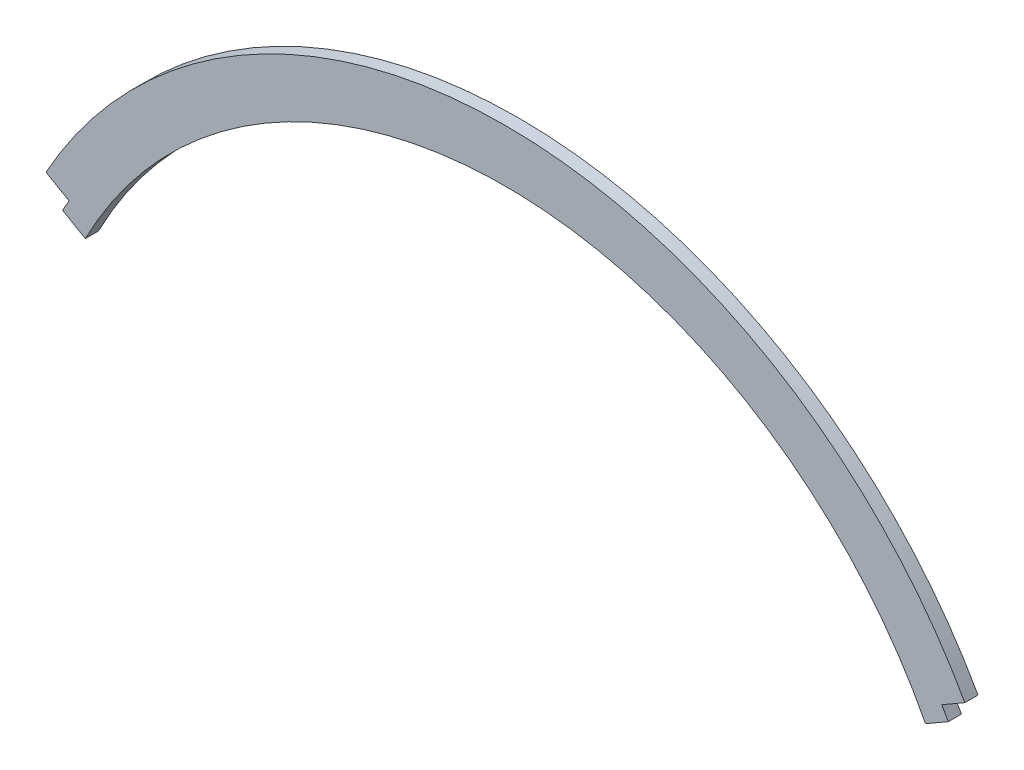
ISO-10303-21;
HEADER;
FILE_DESCRIPTION(('STEP AP214'),'2;1');
FILE_NAME('part.step','',(''),(''),'','','');
FILE_SCHEMA(('AUTOMOTIVE_DESIGN { 1 0 10303 214 1 1 1 1 }'));
ENDSEC;
DATA;
#1=APPLICATION_CONTEXT('core data for automotive mechanical design processes');
#2=APPLICATION_PROTOCOL_DEFINITION('international standard','automotive_design',2000,#1);
#3=PRODUCT_CONTEXT('',#1,'mechanical');
#4=PRODUCT('Part','Part','',(#3));
#5=PRODUCT_RELATED_PRODUCT_CATEGORY('part','',(#4));
#6=PRODUCT_DEFINITION_FORMATION('','',#4);
#7=PRODUCT_DEFINITION_CONTEXT('part definition',#1,'design');
#8=PRODUCT_DEFINITION('design','',#6,#7);
#9=PRODUCT_DEFINITION_SHAPE('','',#8);
#10=(LENGTH_UNIT() NAMED_UNIT(*) SI_UNIT(.MILLI.,.METRE.));
#11=(NAMED_UNIT(*) PLANE_ANGLE_UNIT() SI_UNIT($,.RADIAN.));
#12=(NAMED_UNIT(*) SI_UNIT($,.STERADIAN.) SOLID_ANGLE_UNIT());
#13=UNCERTAINTY_MEASURE_WITH_UNIT(LENGTH_MEASURE(1.E-05),#10,'distance_accuracy_value','');
#14=(GEOMETRIC_REPRESENTATION_CONTEXT(3) GLOBAL_UNCERTAINTY_ASSIGNED_CONTEXT((#13)) GLOBAL_UNIT_ASSIGNED_CONTEXT((#10,
#11,#12)) REPRESENTATION_CONTEXT('',''));
#15=CARTESIAN_POINT('',(0.,0.,0.));
#16=DIRECTION('',(0.,0.,1.));
#17=DIRECTION('',(1.,0.,0.));
#18=AXIS2_PLACEMENT_3D('',#15,#16,#17);
#19=CARTESIAN_POINT('',(101.484623167,0.,3.175));
#20=DIRECTION('',(-0.500000000000001,0.866025403784438,0.));
#21=DIRECTION('',(-0.866025403784438,-0.500000000000001,0.));
#22=AXIS2_PLACEMENT_3D('',#19,#20,#21);
#23=PLANE('',#22);
#24=DIRECTION('',(0.,0.,1.));
#25=VECTOR('',#24,1.);
#26=CARTESIAN_POINT('',(106.98901533572,3.17796230033563,0.));
#27=LINE('',#26,#25);
#28=CARTESIAN_POINT('',(106.98901533572,3.17796230033563,0.));
#29=VERTEX_POINT('',#28);
#30=CARTESIAN_POINT('',(106.98901533572,3.17796230033563,3.175));
#31=VERTEX_POINT('',#30);
#32=EDGE_CURVE('E176',#29,#31,#27,.T.);
#33=ORIENTED_EDGE('',*,*,#32,.T.);
#34=DIRECTION('',(0.866025403784438,0.500000000000001,0.));
#35=VECTOR('',#34,1.);
#36=CARTESIAN_POINT('',(101.484623167,0.,3.175));
#37=LINE('',#36,#35);
#38=CARTESIAN_POINT('',(101.484623167,0.,3.175));
#39=VERTEX_POINT('',#38);
#40=EDGE_CURVE('E126',#39,#31,#37,.T.);
#41=ORIENTED_EDGE('',*,*,#40,.F.);
#42=DIRECTION('',(0.,0.,-1.));
#43=VECTOR('',#42,1.);
#44=CARTESIAN_POINT('',(101.484623167,0.,3.175));
#45=LINE('',#44,#43);
#46=CARTESIAN_POINT('',(101.484623167,0.,0.));
#47=VERTEX_POINT('',#46);
#48=EDGE_CURVE('E136',#39,#47,#45,.T.);
#49=ORIENTED_EDGE('',*,*,#48,.T.);
#50=DIRECTION('',(0.866025403784438,0.500000000000001,0.));
#51=VECTOR('',#50,1.);
#52=CARTESIAN_POINT('',(101.484623167,0.,0.));
#53=LINE('',#52,#51);
#54=EDGE_CURVE('E145',#47,#29,#53,.T.);
#55=ORIENTED_EDGE('',*,*,#54,.T.);
#56=EDGE_LOOP('',(#33,#41,#49,#55));
#57=FACE_BOUND('',#56,.T.);
#58=ADVANCED_FACE('F34',(#57),#23,.F.);
#59=CARTESIAN_POINT('',(0.,-52.5867023177153,3.175));
#60=DIRECTION('',(0.,0.,-1.));
#61=DIRECTION('',(-1.,0.,0.));
#62=AXIS2_PLACEMENT_3D('',#59,#60,#61);
#63=CYLINDRICAL_SURFACE('',#62,127.);
#64=CARTESIAN_POINT('',(0.,-52.5867023177153,0.));
#65=DIRECTION('',(0.,0.,1.));
#66=DIRECTION('',(1.,0.,0.));
#67=AXIS2_PLACEMENT_3D('',#64,#65,#66);
#68=CIRCLE('',#67,127.);
#69=CARTESIAN_POINT('',(110.984177533867,9.15074448024619,0.));
#70=VERTEX_POINT('',#69);
#71=CARTESIAN_POINT('',(-110.984177533867,9.1507444802462,-6.24999999996288E-06));
#72=VERTEX_POINT('',#71);
#73=EDGE_CURVE('E38',#70,#72,#68,.T.);
#74=ORIENTED_EDGE('',*,*,#73,.T.);
#75=DIRECTION('',(0.,0.,1.));
#76=VECTOR('',#75,1.);
#77=CARTESIAN_POINT('',(-110.984177533867,9.15074448024619,-2.49999999998515E-05));
#78=LINE('',#77,#76);
#79=CARTESIAN_POINT('',(-110.984177533867,9.15074448024619,3.175));
#80=VERTEX_POINT('',#79);
#81=EDGE_CURVE('E105',#72,#80,#78,.T.);
#82=ORIENTED_EDGE('',*,*,#81,.T.);
#83=CARTESIAN_POINT('',(0.,-52.5867023177153,3.175));
#84=DIRECTION('',(0.,0.,1.));
#85=DIRECTION('',(1.,0.,0.));
#86=AXIS2_PLACEMENT_3D('',#83,#84,#85);
#87=CIRCLE('',#86,127.);
#88=CARTESIAN_POINT('',(110.984177533867,9.15074448024619,3.175));
#89=VERTEX_POINT('',#88);
#90=EDGE_CURVE('E118',#89,#80,#87,.T.);
#91=ORIENTED_EDGE('',*,*,#90,.F.);
#92=DIRECTION('',(0.,0.,1.));
#93=VECTOR('',#92,1.);
#94=CARTESIAN_POINT('',(110.984177533867,9.15074448024619,0.));
#95=LINE('',#94,#93);
#96=EDGE_CURVE('E174',#70,#89,#95,.T.);
#97=ORIENTED_EDGE('',*,*,#96,.F.);
#98=EDGE_LOOP('',(#74,#82,#91,#97));
#99=FACE_BOUND('',#98,.T.);
#100=ADVANCED_FACE('F116',(#99),#63,.T.);
#101=CARTESIAN_POINT('',(0.,-52.5867023177153,3.175));
#102=DIRECTION('',(0.,0.,1.));
#103=DIRECTION('',(1.,0.,0.));
#104=AXIS2_PLACEMENT_3D('',#101,#102,#103);
#105=PLANE('',#104);
#106=DIRECTION('',(0.500000000000006,0.866025403784435,0.));
#107=VECTOR('',#106,1.);
#108=CARTESIAN_POINT('',(-104.388569598165,7.68206644010615,3.175));
#109=LINE('',#108,#107);
#110=CARTESIAN_POINT('',(-106.98901533572,3.17796230033563,3.175));
#111=VERTEX_POINT('',#110);
#112=CARTESIAN_POINT('',(-105.40151533572,5.92759295735122,3.175));
#113=VERTEX_POINT('',#112);
#114=EDGE_CURVE('E111',#111,#113,#109,.T.);
#115=ORIENTED_EDGE('',*,*,#114,.F.);
#116=DIRECTION('',(0.866025403784438,-0.500000000000001,0.));
#117=VECTOR('',#116,1.);
#118=CARTESIAN_POINT('',(-101.484623167,0.,3.175));
#119=LINE('',#118,#117);
#120=CARTESIAN_POINT('',(-101.484623167,0.,3.175));
#121=VERTEX_POINT('',#120);
#122=EDGE_CURVE('E125',#111,#121,#119,.T.);
#123=ORIENTED_EDGE('',*,*,#122,.T.);
#124=CARTESIAN_POINT('',(0.,-52.5867023177153,3.175));
#125=DIRECTION('',(0.,0.,-1.));
#126=DIRECTION('',(1.,0.,0.));
#127=AXIS2_PLACEMENT_3D('',#124,#125,#126);
#128=CIRCLE('',#127,114.3);
#129=EDGE_CURVE('E131',#121,#39,#128,.T.);
#130=ORIENTED_EDGE('',*,*,#129,.T.);
#131=ORIENTED_EDGE('',*,*,#40,.T.);
#132=DIRECTION('',(-0.500000000000006,0.866025403784435,0.));
#133=VECTOR('',#132,1.);
#134=CARTESIAN_POINT('',(104.388569598165,7.68206644010615,3.175));
#135=LINE('',#134,#133);
#136=CARTESIAN_POINT('',(105.40151533572,5.92759295735122,3.175));
#137=VERTEX_POINT('',#136);
#138=EDGE_CURVE('E146',#31,#137,#135,.T.);
#139=ORIENTED_EDGE('',*,*,#138,.T.);
#140=DIRECTION('',(0.866025403784439,0.5,0.));
#141=VECTOR('',#140,1.);
#142=CARTESIAN_POINT('',(1.01294573755422,-54.3411758004696,3.175));
#143=LINE('',#142,#141);
#144=EDGE_CURVE('E124',#137,#89,#143,.T.);
#145=ORIENTED_EDGE('',*,*,#144,.T.);
#146=ORIENTED_EDGE('',*,*,#90,.T.);
#147=DIRECTION('',(-0.866025403784439,0.5,0.));
#148=VECTOR('',#147,1.);
#149=CARTESIAN_POINT('',(-1.01294573755422,-54.3411758004696,3.175));
#150=LINE('',#149,#148);
#151=EDGE_CURVE('E102',#113,#80,#150,.T.);
#152=ORIENTED_EDGE('',*,*,#151,.F.);
#153=EDGE_LOOP('',(#115,#123,#130,#131,#139,#145,#146,#152));
#154=FACE_BOUND('',#153,.T.);
#155=ADVANCED_FACE('F122',(#154),#105,.T.);
#156=CARTESIAN_POINT('',(0.,-52.5867023177153,0.));
#157=DIRECTION('',(0.,0.,1.));
#158=DIRECTION('',(1.,0.,0.));
#159=AXIS2_PLACEMENT_3D('',#156,#157,#158);
#160=PLANE('',#159);
#161=DIRECTION('',(0.866025403784438,-0.500000000000001,0.));
#162=VECTOR('',#161,1.);
#163=CARTESIAN_POINT('',(-101.484623167,0.,0.));
#164=LINE('',#163,#162);
#165=CARTESIAN_POINT('',(-106.98901533572,3.17796230033562,0.));
#166=VERTEX_POINT('',#165);
#167=CARTESIAN_POINT('',(-101.484623167,0.,0.));
#168=VERTEX_POINT('',#167);
#169=EDGE_CURVE('E150',#166,#168,#164,.T.);
#170=ORIENTED_EDGE('',*,*,#169,.F.);
#171=DIRECTION('',(0.500000000000006,0.866025403784435,0.));
#172=VECTOR('',#171,1.);
#173=CARTESIAN_POINT('',(-104.388569598165,7.68206644010615,0.));
#174=LINE('',#173,#172);
#175=CARTESIAN_POINT('',(-105.40151533572,5.92759295735122,0.));
#176=VERTEX_POINT('',#175);
#177=EDGE_CURVE('E51',#166,#176,#174,.T.);
#178=ORIENTED_EDGE('',*,*,#177,.T.);
#179=DIRECTION('',(-0.866025403784439,0.5,0.));
#180=VECTOR('',#179,1.);
#181=CARTESIAN_POINT('',(-1.01294573755422,-54.3411758004696,0.));
#182=LINE('',#181,#180);
#183=EDGE_CURVE('E11',#176,#72,#182,.T.);
#184=ORIENTED_EDGE('',*,*,#183,.T.);
#185=ORIENTED_EDGE('',*,*,#73,.F.);
#186=DIRECTION('',(0.866025403784439,0.5,0.));
#187=VECTOR('',#186,1.);
#188=CARTESIAN_POINT('',(105.40151533572,5.92759295735122,0.));
#189=LINE('',#188,#187);
#190=CARTESIAN_POINT('',(105.40151533572,5.92759295735121,0.));
#191=VERTEX_POINT('',#190);
#192=EDGE_CURVE('E180',#191,#70,#189,.T.);
#193=ORIENTED_EDGE('',*,*,#192,.F.);
#194=DIRECTION('',(-0.500000000000006,0.866025403784435,0.));
#195=VECTOR('',#194,1.);
#196=CARTESIAN_POINT('',(106.98901533572,3.17796230033563,0.));
#197=LINE('',#196,#195);
#198=EDGE_CURVE('E110',#29,#191,#197,.T.);
#199=ORIENTED_EDGE('',*,*,#198,.F.);
#200=ORIENTED_EDGE('',*,*,#54,.F.);
#201=CARTESIAN_POINT('',(0.,-52.5867023177153,0.));
#202=DIRECTION('',(0.,0.,-1.));
#203=DIRECTION('',(1.,0.,0.));
#204=AXIS2_PLACEMENT_3D('',#201,#202,#203);
#205=CIRCLE('',#204,114.3);
#206=EDGE_CURVE('E142',#168,#47,#205,.T.);
#207=ORIENTED_EDGE('',*,*,#206,.F.);
#208=EDGE_LOOP('',(#170,#178,#184,#185,#193,#199,#200,#207));
#209=FACE_BOUND('',#208,.T.);
#210=ADVANCED_FACE('F164',(#209),#160,.F.);
#211=CARTESIAN_POINT('',(0.,-52.5867023177153,3.175));
#212=DIRECTION('',(0.,0.,-1.));
#213=DIRECTION('',(-1.,0.,0.));
#214=AXIS2_PLACEMENT_3D('',#211,#212,#213);
#215=CYLINDRICAL_SURFACE('',#214,114.3);
#216=ORIENTED_EDGE('',*,*,#206,.T.);
#217=ORIENTED_EDGE('',*,*,#48,.F.);
#218=ORIENTED_EDGE('',*,*,#129,.F.);
#219=DIRECTION('',(0.,0.,-1.));
#220=VECTOR('',#219,1.);
#221=CARTESIAN_POINT('',(-101.484623167,0.,3.175));
#222=LINE('',#221,#220);
#223=EDGE_CURVE('E128',#121,#168,#222,.T.);
#224=ORIENTED_EDGE('',*,*,#223,.T.);
#225=EDGE_LOOP('',(#216,#217,#218,#224));
#226=FACE_BOUND('',#225,.T.);
#227=ADVANCED_FACE('F36',(#226),#215,.F.);
#228=CARTESIAN_POINT('',(-101.484623167,0.,3.175));
#229=DIRECTION('',(0.500000000000001,0.866025403784438,0.));
#230=DIRECTION('',(-0.866025403784438,0.500000000000001,0.));
#231=AXIS2_PLACEMENT_3D('',#228,#229,#230);
#232=PLANE('',#231);
#233=ORIENTED_EDGE('',*,*,#122,.F.);
#234=DIRECTION('',(0.,0.,-1.));
#235=VECTOR('',#234,1.);
#236=CARTESIAN_POINT('',(-106.98901533572,3.17796230033563,3.175));
#237=LINE('',#236,#235);
#238=EDGE_CURVE('E44',#111,#166,#237,.T.);
#239=ORIENTED_EDGE('',*,*,#238,.T.);
#240=ORIENTED_EDGE('',*,*,#169,.T.);
#241=ORIENTED_EDGE('',*,*,#223,.F.);
#242=EDGE_LOOP('',(#233,#239,#240,#241));
#243=FACE_BOUND('',#242,.T.);
#244=ADVANCED_FACE('F162',(#243),#232,.F.);
#245=CARTESIAN_POINT('',(106.98901533572,3.17796230033563,0.));
#246=DIRECTION('',(0.866025403784435,0.500000000000006,0.));
#247=DIRECTION('',(-0.500000000000006,0.866025403784435,0.));
#248=AXIS2_PLACEMENT_3D('',#245,#246,#247);
#249=PLANE('',#248);
#250=ORIENTED_EDGE('',*,*,#32,.F.);
#251=ORIENTED_EDGE('',*,*,#198,.T.);
#252=DIRECTION('',(0.,0.,1.));
#253=VECTOR('',#252,1.);
#254=CARTESIAN_POINT('',(105.40151533572,5.92759295735122,0.));
#255=LINE('',#254,#253);
#256=EDGE_CURVE('E59',#191,#137,#255,.T.);
#257=ORIENTED_EDGE('',*,*,#256,.T.);
#258=ORIENTED_EDGE('',*,*,#138,.F.);
#259=EDGE_LOOP('',(#250,#251,#257,#258));
#260=FACE_BOUND('',#259,.T.);
#261=ADVANCED_FACE('F204',(#260),#249,.T.);
#262=CARTESIAN_POINT('',(105.40151533572,5.92759295735122,0.));
#263=DIRECTION('',(0.5,-0.866025403784439,0.));
#264=DIRECTION('',(0.866025403784439,0.5,0.));
#265=AXIS2_PLACEMENT_3D('',#262,#263,#264);
#266=PLANE('',#265);
#267=ORIENTED_EDGE('',*,*,#256,.F.);
#268=ORIENTED_EDGE('',*,*,#192,.T.);
#269=ORIENTED_EDGE('',*,*,#96,.T.);
#270=ORIENTED_EDGE('',*,*,#144,.F.);
#271=EDGE_LOOP('',(#267,#268,#269,#270));
#272=FACE_BOUND('',#271,.T.);
#273=ADVANCED_FACE('F193',(#272),#266,.T.);
#274=CARTESIAN_POINT('',(-105.40151533572,5.92759295735122,-2.49999999998515E-05));
#275=DIRECTION('',(0.5,0.866025403784439,0.));
#276=DIRECTION('',(-0.866025403784439,0.5,0.));
#277=AXIS2_PLACEMENT_3D('',#274,#275,#276);
#278=PLANE('',#277);
#279=ORIENTED_EDGE('',*,*,#151,.T.);
#280=ORIENTED_EDGE('',*,*,#81,.F.);
#281=ORIENTED_EDGE('',*,*,#183,.F.);
#282=DIRECTION('',(0.,0.,1.));
#283=VECTOR('',#282,1.);
#284=CARTESIAN_POINT('',(-105.40151533572,5.92759295735122,-2.49999999998515E-05));
#285=LINE('',#284,#283);
#286=EDGE_CURVE('E106',#176,#113,#285,.T.);
#287=ORIENTED_EDGE('',*,*,#286,.T.);
#288=EDGE_LOOP('',(#279,#280,#281,#287));
#289=FACE_BOUND('',#288,.T.);
#290=ADVANCED_FACE('F104',(#289),#278,.F.);
#291=CARTESIAN_POINT('',(-106.98901533572,3.17796230033563,-2.49999999998515E-05));
#292=DIRECTION('',(0.866025403784435,-0.500000000000006,0.));
#293=DIRECTION('',(0.500000000000006,0.866025403784435,0.));
#294=AXIS2_PLACEMENT_3D('',#291,#292,#293);
#295=PLANE('',#294);
#296=ORIENTED_EDGE('',*,*,#114,.T.);
#297=ORIENTED_EDGE('',*,*,#286,.F.);
#298=ORIENTED_EDGE('',*,*,#177,.F.);
#299=ORIENTED_EDGE('',*,*,#238,.F.);
#300=EDGE_LOOP('',(#296,#297,#298,#299));
#301=FACE_BOUND('',#300,.T.);
#302=ADVANCED_FACE('F187',(#301),#295,.F.);
#303=CLOSED_SHELL('',(#58,#100,#155,#210,#227,#244,#261,#273,#290,#302));
#304=MANIFOLD_SOLID_BREP('B2',#303);
#305=ADVANCED_BREP_SHAPE_REPRESENTATION('',(#18,#304),#14);
#306=SHAPE_DEFINITION_REPRESENTATION(#9,#305);
ENDSEC;
END-ISO-10303-21;
